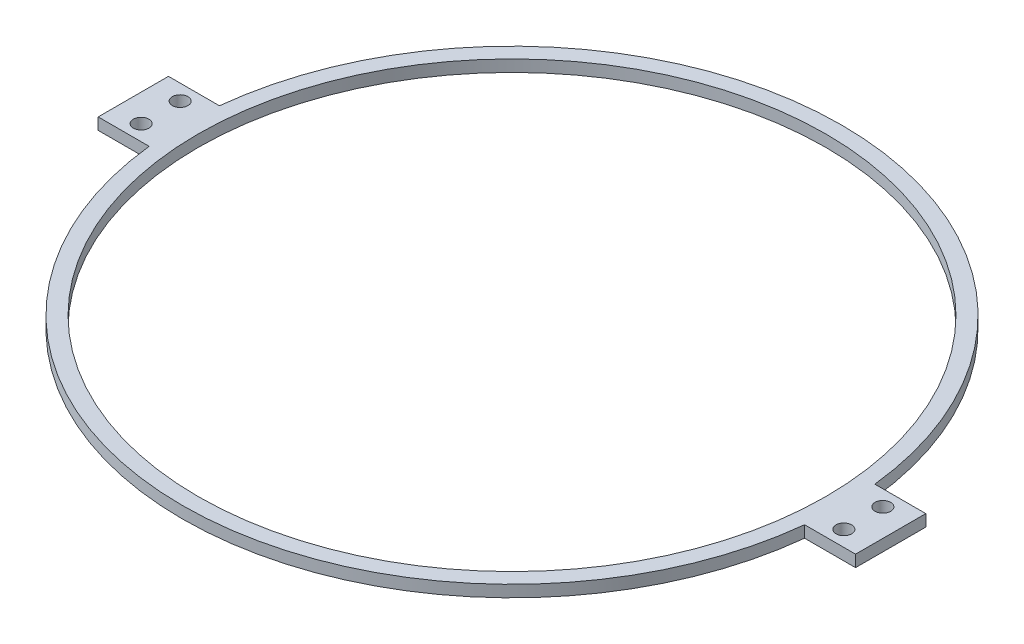
ISO-10303-21;
HEADER;
FILE_DESCRIPTION(('STEP AP214'),'2;1');
FILE_NAME('part.step','',(''),(''),'','','');
FILE_SCHEMA(('AUTOMOTIVE_DESIGN { 1 0 10303 214 1 1 1 1 }'));
ENDSEC;
DATA;
#1=APPLICATION_CONTEXT('core data for automotive mechanical design processes');
#2=APPLICATION_PROTOCOL_DEFINITION('international standard','automotive_design',2000,#1);
#3=PRODUCT_CONTEXT('',#1,'mechanical');
#4=PRODUCT('Part','Part','',(#3));
#5=PRODUCT_RELATED_PRODUCT_CATEGORY('part','',(#4));
#6=PRODUCT_DEFINITION_FORMATION('','',#4);
#7=PRODUCT_DEFINITION_CONTEXT('part definition',#1,'design');
#8=PRODUCT_DEFINITION('design','',#6,#7);
#9=PRODUCT_DEFINITION_SHAPE('','',#8);
#10=(LENGTH_UNIT() NAMED_UNIT(*) SI_UNIT(.MILLI.,.METRE.));
#11=(NAMED_UNIT(*) PLANE_ANGLE_UNIT() SI_UNIT($,.RADIAN.));
#12=(NAMED_UNIT(*) SI_UNIT($,.STERADIAN.) SOLID_ANGLE_UNIT());
#13=UNCERTAINTY_MEASURE_WITH_UNIT(LENGTH_MEASURE(1.E-05),#10,'distance_accuracy_value','');
#14=(GEOMETRIC_REPRESENTATION_CONTEXT(3) GLOBAL_UNCERTAINTY_ASSIGNED_CONTEXT((#13)) GLOBAL_UNIT_ASSIGNED_CONTEXT((#10,
#11,#12)) REPRESENTATION_CONTEXT('',''));
#15=CARTESIAN_POINT('',(0.,0.,0.));
#16=DIRECTION('',(0.,0.,1.));
#17=DIRECTION('',(1.,0.,0.));
#18=AXIS2_PLACEMENT_3D('',#15,#16,#17);
#19=CARTESIAN_POINT('',(0.,3.,-9.00000000000002));
#20=DIRECTION('',(0.,0.,1.));
#21=DIRECTION('',(1.,0.,0.));
#22=AXIS2_PLACEMENT_3D('',#19,#20,#21);
#23=PLANE('',#22);
#24=DIRECTION('',(-1.,0.,0.));
#25=VECTOR('',#24,1.);
#26=CARTESIAN_POINT('',(0.,0.,-9.00000000000002));
#27=LINE('',#26,#25);
#28=CARTESIAN_POINT('',(97.,0.,-9.00000000000005));
#29=VERTEX_POINT('',#28);
#30=CARTESIAN_POINT('',(83.9388849103917,0.,-9.00000000000005));
#31=VERTEX_POINT('',#30);
#32=EDGE_CURVE('E173',#29,#31,#27,.T.);
#33=ORIENTED_EDGE('',*,*,#32,.T.);
#34=DIRECTION('',(0.,-1.,0.));
#35=VECTOR('',#34,1.);
#36=CARTESIAN_POINT('',(83.9388849103917,3.,-9.00000000000005));
#37=LINE('',#36,#35);
#38=CARTESIAN_POINT('',(83.9388849103917,3.,-9.00000000000005));
#39=VERTEX_POINT('',#38);
#40=EDGE_CURVE('E11',#39,#31,#37,.T.);
#41=ORIENTED_EDGE('',*,*,#40,.F.);
#42=DIRECTION('',(-1.,0.,0.));
#43=VECTOR('',#42,1.);
#44=CARTESIAN_POINT('',(0.,3.,-9.00000000000002));
#45=LINE('',#44,#43);
#46=CARTESIAN_POINT('',(97.,3.,-9.00000000000005));
#47=VERTEX_POINT('',#46);
#48=EDGE_CURVE('E248',#47,#39,#45,.T.);
#49=ORIENTED_EDGE('',*,*,#48,.F.);
#50=DIRECTION('',(0.,-1.,0.));
#51=VECTOR('',#50,1.);
#52=CARTESIAN_POINT('',(97.,3.,-9.00000000000005));
#53=LINE('',#52,#51);
#54=EDGE_CURVE('E168',#47,#29,#53,.T.);
#55=ORIENTED_EDGE('',*,*,#54,.T.);
#56=EDGE_LOOP('',(#33,#41,#49,#55));
#57=FACE_BOUND('',#56,.T.);
#58=ADVANCED_FACE('F49',(#57),#23,.F.);
#59=CARTESIAN_POINT('',(0.,3.,0.));
#60=DIRECTION('',(0.,-1.,0.));
#61=DIRECTION('',(0.,0.,-1.));
#62=AXIS2_PLACEMENT_3D('',#59,#60,#61);
#63=CYLINDRICAL_SURFACE('',#62,84.42);
#64=CARTESIAN_POINT('',(0.,0.,0.));
#65=DIRECTION('',(0.,1.,0.));
#66=DIRECTION('',(0.,0.,1.));
#67=AXIS2_PLACEMENT_3D('',#64,#65,#66);
#68=CIRCLE('',#67,84.42);
#69=CARTESIAN_POINT('',(-83.9388849103918,0.,-8.99999999999999));
#70=VERTEX_POINT('',#69);
#71=EDGE_CURVE('E177',#31,#70,#68,.T.);
#72=ORIENTED_EDGE('',*,*,#71,.T.);
#73=DIRECTION('',(0.,-1.,0.));
#74=VECTOR('',#73,1.);
#75=CARTESIAN_POINT('',(-83.9388849103918,3.,-8.99999999999999));
#76=LINE('',#75,#74);
#77=CARTESIAN_POINT('',(-83.9388849103918,3.,-8.99999999999999));
#78=VERTEX_POINT('',#77);
#79=EDGE_CURVE('E59',#78,#70,#76,.T.);
#80=ORIENTED_EDGE('',*,*,#79,.F.);
#81=CARTESIAN_POINT('',(0.,3.,0.));
#82=DIRECTION('',(0.,1.,0.));
#83=DIRECTION('',(0.,0.,1.));
#84=AXIS2_PLACEMENT_3D('',#81,#82,#83);
#85=CIRCLE('',#84,84.42);
#86=EDGE_CURVE('E106',#39,#78,#85,.T.);
#87=ORIENTED_EDGE('',*,*,#86,.F.);
#88=ORIENTED_EDGE('',*,*,#40,.T.);
#89=EDGE_LOOP('',(#72,#80,#87,#88));
#90=FACE_BOUND('',#89,.T.);
#91=ADVANCED_FACE('F232',(#90),#63,.T.);
#92=CARTESIAN_POINT('',(0.,3.,-8.99999999999997));
#93=DIRECTION('',(0.,0.,-1.));
#94=DIRECTION('',(-1.,0.,0.));
#95=AXIS2_PLACEMENT_3D('',#92,#93,#94);
#96=PLANE('',#95);
#97=DIRECTION('',(1.,0.,0.));
#98=VECTOR('',#97,1.);
#99=CARTESIAN_POINT('',(0.,0.,-8.99999999999997));
#100=LINE('',#99,#98);
#101=CARTESIAN_POINT('',(-97.,0.,-8.99999999999999));
#102=VERTEX_POINT('',#101);
#103=EDGE_CURVE('E181',#102,#70,#100,.T.);
#104=ORIENTED_EDGE('',*,*,#103,.F.);
#105=DIRECTION('',(0.,-1.,0.));
#106=VECTOR('',#105,1.);
#107=CARTESIAN_POINT('',(-97.,3.,-8.99999999999999));
#108=LINE('',#107,#106);
#109=CARTESIAN_POINT('',(-97.,3.,-8.99999999999999));
#110=VERTEX_POINT('',#109);
#111=EDGE_CURVE('E223',#110,#102,#108,.T.);
#112=ORIENTED_EDGE('',*,*,#111,.F.);
#113=DIRECTION('',(1.,0.,0.));
#114=VECTOR('',#113,1.);
#115=CARTESIAN_POINT('',(0.,3.,-8.99999999999997));
#116=LINE('',#115,#114);
#117=EDGE_CURVE('E231',#110,#78,#116,.T.);
#118=ORIENTED_EDGE('',*,*,#117,.T.);
#119=ORIENTED_EDGE('',*,*,#79,.T.);
#120=EDGE_LOOP('',(#104,#112,#118,#119));
#121=FACE_BOUND('',#120,.T.);
#122=ADVANCED_FACE('F229',(#121),#96,.T.);
#123=CARTESIAN_POINT('',(-97.,3.,0.));
#124=DIRECTION('',(-1.,0.,0.));
#125=DIRECTION('',(0.,0.,1.));
#126=AXIS2_PLACEMENT_3D('',#123,#124,#125);
#127=PLANE('',#126);
#128=DIRECTION('',(0.,0.,-1.));
#129=VECTOR('',#128,1.);
#130=CARTESIAN_POINT('',(-97.,0.,0.));
#131=LINE('',#130,#129);
#132=CARTESIAN_POINT('',(-97.,0.,9.00000000000001));
#133=VERTEX_POINT('',#132);
#134=EDGE_CURVE('E185',#133,#102,#131,.T.);
#135=ORIENTED_EDGE('',*,*,#134,.F.);
#136=DIRECTION('',(0.,-1.,0.));
#137=VECTOR('',#136,1.);
#138=CARTESIAN_POINT('',(-97.,3.,9.00000000000001));
#139=LINE('',#138,#137);
#140=CARTESIAN_POINT('',(-97.,3.,9.00000000000001));
#141=VERTEX_POINT('',#140);
#142=EDGE_CURVE('E220',#141,#133,#139,.T.);
#143=ORIENTED_EDGE('',*,*,#142,.F.);
#144=DIRECTION('',(0.,0.,-1.));
#145=VECTOR('',#144,1.);
#146=CARTESIAN_POINT('',(-97.,3.,0.));
#147=LINE('',#146,#145);
#148=EDGE_CURVE('E243',#141,#110,#147,.T.);
#149=ORIENTED_EDGE('',*,*,#148,.T.);
#150=ORIENTED_EDGE('',*,*,#111,.T.);
#151=EDGE_LOOP('',(#135,#143,#149,#150));
#152=FACE_BOUND('',#151,.T.);
#153=ADVANCED_FACE('F241',(#152),#127,.T.);
#154=CARTESIAN_POINT('',(0.,3.,8.99999999999998));
#155=DIRECTION('',(0.,0.,-1.));
#156=DIRECTION('',(-1.,0.,0.));
#157=AXIS2_PLACEMENT_3D('',#154,#155,#156);
#158=PLANE('',#157);
#159=DIRECTION('',(1.,0.,0.));
#160=VECTOR('',#159,1.);
#161=CARTESIAN_POINT('',(0.,0.,8.99999999999998));
#162=LINE('',#161,#160);
#163=CARTESIAN_POINT('',(-83.9388849103918,0.,9.00000000000001));
#164=VERTEX_POINT('',#163);
#165=EDGE_CURVE('E189',#133,#164,#162,.T.);
#166=ORIENTED_EDGE('',*,*,#165,.T.);
#167=DIRECTION('',(0.,-1.,0.));
#168=VECTOR('',#167,1.);
#169=CARTESIAN_POINT('',(-83.9388849103918,3.,9.00000000000001));
#170=LINE('',#169,#168);
#171=CARTESIAN_POINT('',(-83.9388849103918,3.,9.00000000000001));
#172=VERTEX_POINT('',#171);
#173=EDGE_CURVE('E142',#172,#164,#170,.T.);
#174=ORIENTED_EDGE('',*,*,#173,.F.);
#175=DIRECTION('',(1.,0.,0.));
#176=VECTOR('',#175,1.);
#177=CARTESIAN_POINT('',(0.,3.,8.99999999999998));
#178=LINE('',#177,#176);
#179=EDGE_CURVE('E127',#141,#172,#178,.T.);
#180=ORIENTED_EDGE('',*,*,#179,.F.);
#181=ORIENTED_EDGE('',*,*,#142,.T.);
#182=EDGE_LOOP('',(#166,#174,#180,#181));
#183=FACE_BOUND('',#182,.T.);
#184=ADVANCED_FACE('F281',(#183),#158,.F.);
#185=CARTESIAN_POINT('',(83.9388849103918,0.,8.99999999999995));
#186=VERTEX_POINT('',#185);
#187=EDGE_CURVE('E137',#164,#186,#68,.T.);
#188=ORIENTED_EDGE('',*,*,#187,.T.);
#189=DIRECTION('',(0.,-1.,0.));
#190=VECTOR('',#189,1.);
#191=CARTESIAN_POINT('',(83.9388849103918,3.,8.99999999999995));
#192=LINE('',#191,#190);
#193=CARTESIAN_POINT('',(83.9388849103918,3.,8.99999999999995));
#194=VERTEX_POINT('',#193);
#195=EDGE_CURVE('E134',#194,#186,#192,.T.);
#196=ORIENTED_EDGE('',*,*,#195,.F.);
#197=EDGE_CURVE('E119',#172,#194,#85,.T.);
#198=ORIENTED_EDGE('',*,*,#197,.F.);
#199=ORIENTED_EDGE('',*,*,#173,.T.);
#200=EDGE_LOOP('',(#188,#196,#198,#199));
#201=FACE_BOUND('',#200,.T.);
#202=ADVANCED_FACE('F135',(#201),#63,.T.);
#203=CARTESIAN_POINT('',(0.,3.,8.99999999999993));
#204=DIRECTION('',(0.,0.,1.));
#205=DIRECTION('',(1.,0.,0.));
#206=AXIS2_PLACEMENT_3D('',#203,#204,#205);
#207=PLANE('',#206);
#208=DIRECTION('',(-1.,0.,0.));
#209=VECTOR('',#208,1.);
#210=CARTESIAN_POINT('',(0.,0.,8.99999999999993));
#211=LINE('',#210,#209);
#212=CARTESIAN_POINT('',(97.,0.,8.99999999999995));
#213=VERTEX_POINT('',#212);
#214=EDGE_CURVE('E192',#213,#186,#211,.T.);
#215=ORIENTED_EDGE('',*,*,#214,.F.);
#216=DIRECTION('',(0.,-1.,0.));
#217=VECTOR('',#216,1.);
#218=CARTESIAN_POINT('',(97.,3.,8.99999999999995));
#219=LINE('',#218,#217);
#220=CARTESIAN_POINT('',(97.,3.,8.99999999999995));
#221=VERTEX_POINT('',#220);
#222=EDGE_CURVE('E95',#221,#213,#219,.T.);
#223=ORIENTED_EDGE('',*,*,#222,.F.);
#224=DIRECTION('',(-1.,0.,0.));
#225=VECTOR('',#224,1.);
#226=CARTESIAN_POINT('',(0.,3.,8.99999999999993));
#227=LINE('',#226,#225);
#228=EDGE_CURVE('E124',#221,#194,#227,.T.);
#229=ORIENTED_EDGE('',*,*,#228,.T.);
#230=ORIENTED_EDGE('',*,*,#195,.T.);
#231=EDGE_LOOP('',(#215,#223,#229,#230));
#232=FACE_BOUND('',#231,.T.);
#233=ADVANCED_FACE('F144',(#232),#207,.T.);
#234=CARTESIAN_POINT('',(-90.,3.,5.));
#235=DIRECTION('',(0.,-1.,0.));
#236=DIRECTION('',(0.,0.,-1.));
#237=AXIS2_PLACEMENT_3D('',#234,#235,#236);
#238=CYLINDRICAL_SURFACE('',#237,2.);
#239=CARTESIAN_POINT('',(-90.,3.,5.));
#240=DIRECTION('',(0.,1.,0.));
#241=DIRECTION('',(0.,0.,1.));
#242=AXIS2_PLACEMENT_3D('',#239,#240,#241);
#243=CIRCLE('',#242,2.);
#244=CARTESIAN_POINT('',(-90.,3.,7.));
#245=VERTEX_POINT('',#244);
#246=EDGE_CURVE('E160',#245,#245,#243,.T.);
#247=ORIENTED_EDGE('',*,*,#246,.T.);
#248=EDGE_LOOP('',(#247));
#249=FACE_BOUND('',#248,.T.);
#250=CARTESIAN_POINT('',(-90.,0.,5.));
#251=DIRECTION('',(0.,1.,0.));
#252=DIRECTION('',(0.,0.,1.));
#253=AXIS2_PLACEMENT_3D('',#250,#251,#252);
#254=CIRCLE('',#253,2.);
#255=CARTESIAN_POINT('',(-90.,0.,7.));
#256=VERTEX_POINT('',#255);
#257=EDGE_CURVE('E205',#256,#256,#254,.T.);
#258=ORIENTED_EDGE('',*,*,#257,.F.);
#259=EDGE_LOOP('',(#258));
#260=FACE_BOUND('',#259,.T.);
#261=ADVANCED_FACE('F288',(#249,#260),#238,.F.);
#262=CARTESIAN_POINT('',(0.,3.,0.));
#263=DIRECTION('',(0.,-1.,0.));
#264=DIRECTION('',(0.,0.,-1.));
#265=AXIS2_PLACEMENT_3D('',#262,#263,#264);
#266=CYLINDRICAL_SURFACE('',#265,80.42);
#267=CARTESIAN_POINT('',(0.,3.,0.));
#268=DIRECTION('',(0.,1.,0.));
#269=DIRECTION('',(0.,0.,1.));
#270=AXIS2_PLACEMENT_3D('',#267,#268,#269);
#271=CIRCLE('',#270,80.42);
#272=CARTESIAN_POINT('',(0.,3.,80.42));
#273=VERTEX_POINT('',#272);
#274=EDGE_CURVE('E156',#273,#273,#271,.T.);
#275=ORIENTED_EDGE('',*,*,#274,.T.);
#276=EDGE_LOOP('',(#275));
#277=FACE_BOUND('',#276,.T.);
#278=CARTESIAN_POINT('',(0.,0.,0.));
#279=DIRECTION('',(0.,1.,0.));
#280=DIRECTION('',(0.,0.,1.));
#281=AXIS2_PLACEMENT_3D('',#278,#279,#280);
#282=CIRCLE('',#281,80.42);
#283=CARTESIAN_POINT('',(0.,0.,80.42));
#284=VERTEX_POINT('',#283);
#285=EDGE_CURVE('E201',#284,#284,#282,.T.);
#286=ORIENTED_EDGE('',*,*,#285,.F.);
#287=EDGE_LOOP('',(#286));
#288=FACE_BOUND('',#287,.T.);
#289=ADVANCED_FACE('F294',(#277,#288),#266,.F.);
#290=CARTESIAN_POINT('',(90.,3.,4.99999999999994));
#291=DIRECTION('',(0.,-1.,0.));
#292=DIRECTION('',(0.,0.,-1.));
#293=AXIS2_PLACEMENT_3D('',#290,#291,#292);
#294=CYLINDRICAL_SURFACE('',#293,2.);
#295=CARTESIAN_POINT('',(90.,3.,4.99999999999994));
#296=DIRECTION('',(0.,1.,0.));
#297=DIRECTION('',(0.,0.,1.));
#298=AXIS2_PLACEMENT_3D('',#295,#296,#297);
#299=CIRCLE('',#298,2.);
#300=CARTESIAN_POINT('',(90.,3.,6.99999999999994));
#301=VERTEX_POINT('',#300);
#302=EDGE_CURVE('E148',#301,#301,#299,.F.);
#303=ORIENTED_EDGE('',*,*,#302,.F.);
#304=EDGE_LOOP('',(#303));
#305=FACE_BOUND('',#304,.T.);
#306=CARTESIAN_POINT('',(90.,0.,4.99999999999994));
#307=DIRECTION('',(0.,1.,0.));
#308=DIRECTION('',(0.,0.,1.));
#309=AXIS2_PLACEMENT_3D('',#306,#307,#308);
#310=CIRCLE('',#309,2.);
#311=CARTESIAN_POINT('',(90.,0.,6.99999999999994));
#312=VERTEX_POINT('',#311);
#313=EDGE_CURVE('E197',#312,#312,#310,.F.);
#314=ORIENTED_EDGE('',*,*,#313,.T.);
#315=EDGE_LOOP('',(#314));
#316=FACE_BOUND('',#315,.T.);
#317=ADVANCED_FACE('F291',(#305,#316),#294,.F.);
#318=CARTESIAN_POINT('',(97.,3.,0.));
#319=DIRECTION('',(-1.,0.,0.));
#320=DIRECTION('',(0.,0.,1.));
#321=AXIS2_PLACEMENT_3D('',#318,#319,#320);
#322=PLANE('',#321);
#323=DIRECTION('',(0.,0.,-1.));
#324=VECTOR('',#323,1.);
#325=CARTESIAN_POINT('',(97.,0.,0.));
#326=LINE('',#325,#324);
#327=EDGE_CURVE('E98',#213,#29,#326,.T.);
#328=ORIENTED_EDGE('',*,*,#327,.T.);
#329=ORIENTED_EDGE('',*,*,#54,.F.);
#330=DIRECTION('',(0.,0.,-1.));
#331=VECTOR('',#330,1.);
#332=CARTESIAN_POINT('',(97.,3.,0.));
#333=LINE('',#332,#331);
#334=EDGE_CURVE('E67',#221,#47,#333,.T.);
#335=ORIENTED_EDGE('',*,*,#334,.F.);
#336=ORIENTED_EDGE('',*,*,#222,.T.);
#337=EDGE_LOOP('',(#328,#329,#335,#336));
#338=FACE_BOUND('',#337,.T.);
#339=ADVANCED_FACE('F260',(#338),#322,.F.);
#340=CARTESIAN_POINT('',(90.,3.,-5.00000000000006));
#341=DIRECTION('',(0.,-1.,0.));
#342=DIRECTION('',(0.,0.,-1.));
#343=AXIS2_PLACEMENT_3D('',#340,#341,#342);
#344=CYLINDRICAL_SURFACE('',#343,2.);
#345=CARTESIAN_POINT('',(90.,3.,-5.00000000000006));
#346=DIRECTION('',(0.,1.,0.));
#347=DIRECTION('',(0.,0.,1.));
#348=AXIS2_PLACEMENT_3D('',#345,#346,#347);
#349=CIRCLE('',#348,2.);
#350=CARTESIAN_POINT('',(90.,3.,-3.00000000000006));
#351=VERTEX_POINT('',#350);
#352=EDGE_CURVE('E213',#351,#351,#349,.F.);
#353=ORIENTED_EDGE('',*,*,#352,.F.);
#354=EDGE_LOOP('',(#353));
#355=FACE_BOUND('',#354,.T.);
#356=CARTESIAN_POINT('',(90.,0.,-5.00000000000006));
#357=DIRECTION('',(0.,1.,0.));
#358=DIRECTION('',(0.,0.,1.));
#359=AXIS2_PLACEMENT_3D('',#356,#357,#358);
#360=CIRCLE('',#359,2.);
#361=CARTESIAN_POINT('',(90.,0.,-3.00000000000006));
#362=VERTEX_POINT('',#361);
#363=EDGE_CURVE('E169',#362,#362,#360,.F.);
#364=ORIENTED_EDGE('',*,*,#363,.T.);
#365=EDGE_LOOP('',(#364));
#366=FACE_BOUND('',#365,.T.);
#367=ADVANCED_FACE('F51',(#355,#366),#344,.F.);
#368=CARTESIAN_POINT('',(-90.,3.,-5.));
#369=DIRECTION('',(0.,-1.,0.));
#370=DIRECTION('',(0.,0.,-1.));
#371=AXIS2_PLACEMENT_3D('',#368,#369,#370);
#372=CYLINDRICAL_SURFACE('',#371,2.);
#373=CARTESIAN_POINT('',(-90.,3.,-5.));
#374=DIRECTION('',(0.,1.,0.));
#375=DIRECTION('',(0.,0.,1.));
#376=AXIS2_PLACEMENT_3D('',#373,#374,#375);
#377=CIRCLE('',#376,2.);
#378=CARTESIAN_POINT('',(-90.,3.,-3.));
#379=VERTEX_POINT('',#378);
#380=EDGE_CURVE('E164',#379,#379,#377,.T.);
#381=ORIENTED_EDGE('',*,*,#380,.T.);
#382=EDGE_LOOP('',(#381));
#383=FACE_BOUND('',#382,.T.);
#384=CARTESIAN_POINT('',(-90.,0.,-5.));
#385=DIRECTION('',(0.,1.,0.));
#386=DIRECTION('',(0.,0.,1.));
#387=AXIS2_PLACEMENT_3D('',#384,#385,#386);
#388=CIRCLE('',#387,2.);
#389=CARTESIAN_POINT('',(-90.,0.,-3.));
#390=VERTEX_POINT('',#389);
#391=EDGE_CURVE('E209',#390,#390,#388,.T.);
#392=ORIENTED_EDGE('',*,*,#391,.F.);
#393=EDGE_LOOP('',(#392));
#394=FACE_BOUND('',#393,.T.);
#395=ADVANCED_FACE('F259',(#383,#394),#372,.F.);
#396=CARTESIAN_POINT('',(0.,3.,0.));
#397=DIRECTION('',(0.,1.,0.));
#398=DIRECTION('',(0.,0.,1.));
#399=AXIS2_PLACEMENT_3D('',#396,#397,#398);
#400=PLANE('',#399);
#401=ORIENTED_EDGE('',*,*,#352,.T.);
#402=EDGE_LOOP('',(#401));
#403=FACE_BOUND('',#402,.T.);
#404=ORIENTED_EDGE('',*,*,#48,.T.);
#405=ORIENTED_EDGE('',*,*,#86,.T.);
#406=ORIENTED_EDGE('',*,*,#117,.F.);
#407=ORIENTED_EDGE('',*,*,#148,.F.);
#408=ORIENTED_EDGE('',*,*,#179,.T.);
#409=ORIENTED_EDGE('',*,*,#197,.T.);
#410=ORIENTED_EDGE('',*,*,#228,.F.);
#411=ORIENTED_EDGE('',*,*,#334,.T.);
#412=EDGE_LOOP('',(#404,#405,#406,#407,#408,#409,#410,#411));
#413=FACE_BOUND('',#412,.T.);
#414=ORIENTED_EDGE('',*,*,#302,.T.);
#415=EDGE_LOOP('',(#414));
#416=FACE_BOUND('',#415,.T.);
#417=ORIENTED_EDGE('',*,*,#274,.F.);
#418=EDGE_LOOP('',(#417));
#419=FACE_BOUND('',#418,.T.);
#420=ORIENTED_EDGE('',*,*,#246,.F.);
#421=EDGE_LOOP('',(#420));
#422=FACE_BOUND('',#421,.T.);
#423=ORIENTED_EDGE('',*,*,#380,.F.);
#424=EDGE_LOOP('',(#423));
#425=FACE_BOUND('',#424,.T.);
#426=ADVANCED_FACE('F121',(#403,#413,#416,#419,#422,#425),#400,.T.);
#427=CARTESIAN_POINT('',(0.,0.,0.));
#428=DIRECTION('',(0.,1.,0.));
#429=DIRECTION('',(0.,0.,1.));
#430=AXIS2_PLACEMENT_3D('',#427,#428,#429);
#431=PLANE('',#430);
#432=ORIENTED_EDGE('',*,*,#363,.F.);
#433=EDGE_LOOP('',(#432));
#434=FACE_BOUND('',#433,.T.);
#435=ORIENTED_EDGE('',*,*,#32,.F.);
#436=ORIENTED_EDGE('',*,*,#327,.F.);
#437=ORIENTED_EDGE('',*,*,#214,.T.);
#438=ORIENTED_EDGE('',*,*,#187,.F.);
#439=ORIENTED_EDGE('',*,*,#165,.F.);
#440=ORIENTED_EDGE('',*,*,#134,.T.);
#441=ORIENTED_EDGE('',*,*,#103,.T.);
#442=ORIENTED_EDGE('',*,*,#71,.F.);
#443=EDGE_LOOP('',(#435,#436,#437,#438,#439,#440,#441,#442));
#444=FACE_BOUND('',#443,.T.);
#445=ORIENTED_EDGE('',*,*,#313,.F.);
#446=EDGE_LOOP('',(#445));
#447=FACE_BOUND('',#446,.T.);
#448=ORIENTED_EDGE('',*,*,#285,.T.);
#449=EDGE_LOOP('',(#448));
#450=FACE_BOUND('',#449,.T.);
#451=ORIENTED_EDGE('',*,*,#257,.T.);
#452=EDGE_LOOP('',(#451));
#453=FACE_BOUND('',#452,.T.);
#454=ORIENTED_EDGE('',*,*,#391,.T.);
#455=EDGE_LOOP('',(#454));
#456=FACE_BOUND('',#455,.T.);
#457=ADVANCED_FACE('F236',(#434,#444,#447,#450,#453,#456),#431,.F.);
#458=CLOSED_SHELL('',(#58,#91,#122,#153,#184,#202,#233,#261,#289,#317,#339,#367,#395,#426,#457));
#459=MANIFOLD_SOLID_BREP('B2',#458);
#460=ADVANCED_BREP_SHAPE_REPRESENTATION('',(#18,#459),#14);
#461=SHAPE_DEFINITION_REPRESENTATION(#9,#460);
ENDSEC;
END-ISO-10303-21;
